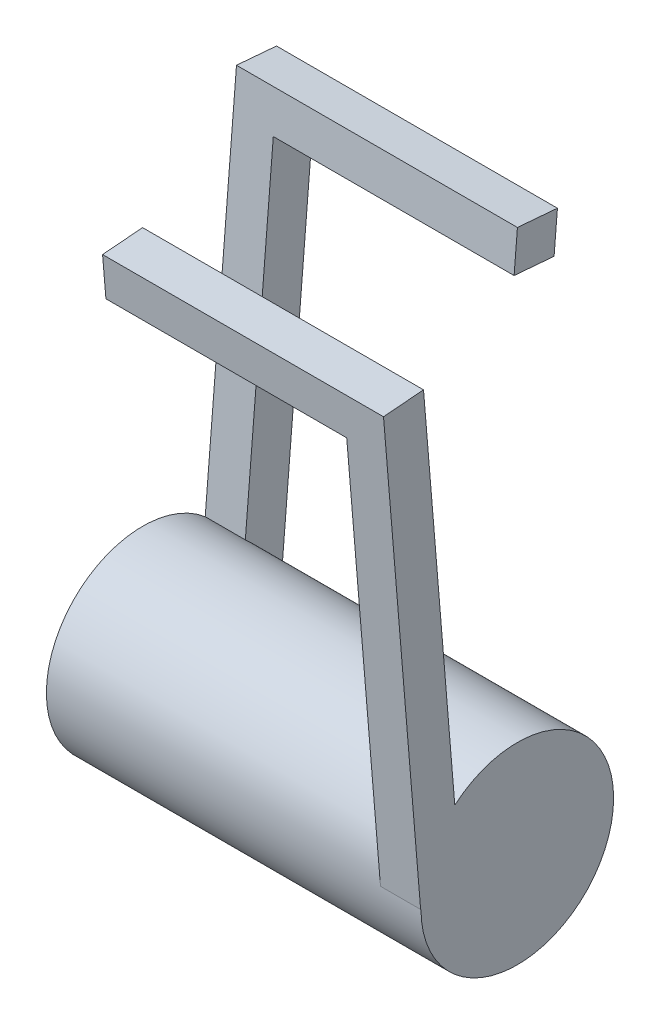
ISO-10303-21;
HEADER;
FILE_DESCRIPTION(('STEP AP214'),'2;1');
FILE_NAME('part.step','',(''),(''),'','','');
FILE_SCHEMA(('AUTOMOTIVE_DESIGN { 1 0 10303 214 1 1 1 1 }'));
ENDSEC;
DATA;
#1=APPLICATION_CONTEXT('core data for automotive mechanical design processes');
#2=APPLICATION_PROTOCOL_DEFINITION('international standard','automotive_design',2000,#1);
#3=PRODUCT_CONTEXT('',#1,'mechanical');
#4=PRODUCT('Part','Part','',(#3));
#5=PRODUCT_RELATED_PRODUCT_CATEGORY('part','',(#4));
#6=PRODUCT_DEFINITION_FORMATION('','',#4);
#7=PRODUCT_DEFINITION_CONTEXT('part definition',#1,'design');
#8=PRODUCT_DEFINITION('design','',#6,#7);
#9=PRODUCT_DEFINITION_SHAPE('','',#8);
#10=(LENGTH_UNIT() NAMED_UNIT(*) SI_UNIT(.MILLI.,.METRE.));
#11=(NAMED_UNIT(*) PLANE_ANGLE_UNIT() SI_UNIT($,.RADIAN.));
#12=(NAMED_UNIT(*) SI_UNIT($,.STERADIAN.) SOLID_ANGLE_UNIT());
#13=UNCERTAINTY_MEASURE_WITH_UNIT(LENGTH_MEASURE(1.E-05),#10,'distance_accuracy_value','');
#14=(GEOMETRIC_REPRESENTATION_CONTEXT(3) GLOBAL_UNCERTAINTY_ASSIGNED_CONTEXT((#13)) GLOBAL_UNIT_ASSIGNED_CONTEXT((#10,
#11,#12)) REPRESENTATION_CONTEXT('',''));
#15=CARTESIAN_POINT('',(0.,0.,0.));
#16=DIRECTION('',(0.,0.,1.));
#17=DIRECTION('',(1.,0.,0.));
#18=AXIS2_PLACEMENT_3D('',#15,#16,#17);
#19=CARTESIAN_POINT('',(14.,0.,0.));
#20=DIRECTION('',(-1.,0.,0.));
#21=DIRECTION('',(0.,0.,1.));
#22=AXIS2_PLACEMENT_3D('',#19,#20,#21);
#23=CYLINDRICAL_SURFACE('',#22,3.6);
#24=CARTESIAN_POINT('',(12.5,0.,0.));
#25=DIRECTION('',(1.,0.,0.));
#26=DIRECTION('',(0.,0.,-1.));
#27=AXIS2_PLACEMENT_3D('',#24,#25,#26);
#28=CIRCLE('',#27,3.6);
#29=CARTESIAN_POINT('',(12.5,2.73945118906813,2.33568131017765));
#30=VERTEX_POINT('',#29);
#31=CARTESIAN_POINT('',(12.5,0.00104134907400366,3.59999984938779));
#32=VERTEX_POINT('',#31);
#33=EDGE_CURVE('E11',#30,#32,#28,.T.);
#34=ORIENTED_EDGE('',*,*,#33,.F.);
#35=DIRECTION('',(-1.,0.,0.));
#36=VECTOR('',#35,1.);
#37=CARTESIAN_POINT('',(14.,2.73945118906813,2.33568131017765));
#38=LINE('',#37,#36);
#39=CARTESIAN_POINT('',(14.,2.73945118906813,2.33568131017765));
#40=VERTEX_POINT('',#39);
#41=EDGE_CURVE('E189',#30,#40,#38,.F.);
#42=ORIENTED_EDGE('',*,*,#41,.T.);
#43=CARTESIAN_POINT('',(14.,0.,0.));
#44=DIRECTION('',(1.,0.,0.));
#45=DIRECTION('',(0.,0.,-1.));
#46=AXIS2_PLACEMENT_3D('',#43,#44,#45);
#47=CIRCLE('',#46,3.6);
#48=CARTESIAN_POINT('',(14.,0.00104134907400366,3.59999984938779));
#49=VERTEX_POINT('',#48);
#50=EDGE_CURVE('E241',#49,#40,#47,.T.);
#51=ORIENTED_EDGE('',*,*,#50,.F.);
#52=DIRECTION('',(-1.,0.,0.));
#53=VECTOR('',#52,1.);
#54=CARTESIAN_POINT('',(14.,0.00104134907400366,3.59999984938779));
#55=LINE('',#54,#53);
#56=EDGE_CURVE('E183',#49,#32,#55,.T.);
#57=ORIENTED_EDGE('',*,*,#56,.T.);
#58=EDGE_LOOP('',(#34,#42,#51,#57));
#59=FACE_BOUND('',#58,.T.);
#60=CARTESIAN_POINT('',(1.5,0.,0.));
#61=DIRECTION('',(-1.,0.,0.));
#62=DIRECTION('',(0.,0.,1.));
#63=AXIS2_PLACEMENT_3D('',#60,#61,#62);
#64=CIRCLE('',#63,3.6);
#65=CARTESIAN_POINT('',(1.5,2.73945118906813,-2.33568131017765));
#66=VERTEX_POINT('',#65);
#67=CARTESIAN_POINT('',(1.5,0.00104134907400366,-3.59999984938779));
#68=VERTEX_POINT('',#67);
#69=EDGE_CURVE('E40',#66,#68,#64,.T.);
#70=ORIENTED_EDGE('',*,*,#69,.F.);
#71=DIRECTION('',(-1.,0.,0.));
#72=VECTOR('',#71,1.);
#73=CARTESIAN_POINT('',(14.,2.73945118906813,-2.33568131017765));
#74=LINE('',#73,#72);
#75=CARTESIAN_POINT('',(0.,2.73945118906813,-2.33568131017765));
#76=VERTEX_POINT('',#75);
#77=EDGE_CURVE('E237',#66,#76,#74,.T.);
#78=ORIENTED_EDGE('',*,*,#77,.T.);
#79=CARTESIAN_POINT('',(0.,0.,0.));
#80=DIRECTION('',(1.,0.,0.));
#81=DIRECTION('',(0.,0.,-1.));
#82=AXIS2_PLACEMENT_3D('',#79,#80,#81);
#83=CIRCLE('',#82,3.6);
#84=CARTESIAN_POINT('',(0.,0.00104134907400366,-3.59999984938779));
#85=VERTEX_POINT('',#84);
#86=EDGE_CURVE('E240',#76,#85,#83,.T.);
#87=ORIENTED_EDGE('',*,*,#86,.T.);
#88=DIRECTION('',(-1.,0.,0.));
#89=VECTOR('',#88,1.);
#90=CARTESIAN_POINT('',(14.,0.00104134907400366,-3.59999984938779));
#91=LINE('',#90,#89);
#92=EDGE_CURVE('E55',#85,#68,#91,.F.);
#93=ORIENTED_EDGE('',*,*,#92,.T.);
#94=EDGE_LOOP('',(#70,#78,#87,#93));
#95=FACE_BOUND('',#94,.T.);
#96=ADVANCED_FACE('F33',(#59,#95),#23,.T.);
#97=CARTESIAN_POINT('',(14.,0.,0.));
#98=DIRECTION('',(1.,0.,0.));
#99=DIRECTION('',(0.,0.,-1.));
#100=AXIS2_PLACEMENT_3D('',#97,#98,#99);
#101=PLANE('',#100);
#102=ORIENTED_EDGE('',*,*,#50,.T.);
#103=DIRECTION('',(0.,0.99654251223919,0.0830844227277468));
#104=VECTOR('',#103,1.);
#105=CARTESIAN_POINT('',(14.,16.7668865884861,3.50518623164122));
#106=LINE('',#105,#104);
#107=CARTESIAN_POINT('',(14.,16.7668865884861,3.50518623164122));
#108=VERTEX_POINT('',#107);
#109=EDGE_CURVE('E177',#40,#108,#106,.T.);
#110=ORIENTED_EDGE('',*,*,#109,.T.);
#111=DIRECTION('',(0.,-0.0830844227277459,0.99654251223919));
#112=VECTOR('',#111,1.);
#113=CARTESIAN_POINT('',(14.,16.6422599543945,5.));
#114=LINE('',#113,#112);
#115=CARTESIAN_POINT('',(14.,16.6422599543945,5.));
#116=VERTEX_POINT('',#115);
#117=EDGE_CURVE('E170',#108,#116,#114,.T.);
#118=ORIENTED_EDGE('',*,*,#117,.T.);
#119=DIRECTION('',(0.,-0.99654251223919,-0.0830844227277466));
#120=VECTOR('',#119,1.);
#121=CARTESIAN_POINT('',(14.,16.6422599543945,5.));
#122=LINE('',#121,#120);
#123=CARTESIAN_POINT('',(14.,0.,3.61249014044663));
#124=VERTEX_POINT('',#123);
#125=EDGE_CURVE('E165',#116,#124,#122,.T.);
#126=ORIENTED_EDGE('',*,*,#125,.T.);
#127=DIRECTION('',(0.,0.083084422727747,-0.99654251223919));
#128=VECTOR('',#127,1.);
#129=CARTESIAN_POINT('',(14.,0.,3.61249014044663));
#130=LINE('',#129,#128);
#131=EDGE_CURVE('E47',#124,#49,#130,.T.);
#132=ORIENTED_EDGE('',*,*,#131,.T.);
#133=EDGE_LOOP('',(#102,#110,#118,#126,#132));
#134=FACE_BOUND('',#133,.T.);
#135=ADVANCED_FACE('F283',(#134),#101,.T.);
#136=CARTESIAN_POINT('',(0.,0.,0.));
#137=DIRECTION('',(1.,0.,0.));
#138=DIRECTION('',(0.,0.,-1.));
#139=AXIS2_PLACEMENT_3D('',#136,#137,#138);
#140=PLANE('',#139);
#141=ORIENTED_EDGE('',*,*,#86,.F.);
#142=DIRECTION('',(0.,0.99654251223919,-0.0830844227277468));
#143=VECTOR('',#142,1.);
#144=CARTESIAN_POINT('',(0.,16.7668865884861,-3.50518623164122));
#145=LINE('',#144,#143);
#146=CARTESIAN_POINT('',(0.,16.7668865884861,-3.50518623164122));
#147=VERTEX_POINT('',#146);
#148=EDGE_CURVE('E226',#76,#147,#145,.T.);
#149=ORIENTED_EDGE('',*,*,#148,.T.);
#150=DIRECTION('',(0.,-0.0830844227277459,-0.99654251223919));
#151=VECTOR('',#150,1.);
#152=CARTESIAN_POINT('',(0.,16.6422599543945,-5.));
#153=LINE('',#152,#151);
#154=CARTESIAN_POINT('',(0.,16.6422599543945,-5.));
#155=VERTEX_POINT('',#154);
#156=EDGE_CURVE('E214',#147,#155,#153,.T.);
#157=ORIENTED_EDGE('',*,*,#156,.T.);
#158=DIRECTION('',(0.,-0.99654251223919,0.0830844227277466));
#159=VECTOR('',#158,1.);
#160=CARTESIAN_POINT('',(0.,16.6422599543945,-5.));
#161=LINE('',#160,#159);
#162=CARTESIAN_POINT('',(0.,0.,-3.61249014044663));
#163=VERTEX_POINT('',#162);
#164=EDGE_CURVE('E209',#155,#163,#161,.T.);
#165=ORIENTED_EDGE('',*,*,#164,.T.);
#166=DIRECTION('',(0.,0.083084422727747,0.99654251223919));
#167=VECTOR('',#166,1.);
#168=CARTESIAN_POINT('',(0.,0.,-3.61249014044663));
#169=LINE('',#168,#167);
#170=EDGE_CURVE('E223',#163,#85,#169,.T.);
#171=ORIENTED_EDGE('',*,*,#170,.T.);
#172=EDGE_LOOP('',(#141,#149,#157,#165,#171));
#173=FACE_BOUND('',#172,.T.);
#174=ADVANCED_FACE('F264',(#173),#140,.F.);
#175=CARTESIAN_POINT('',(1.5,16.7668865884861,-3.50518623164122));
#176=DIRECTION('',(0.,0.0830844227277468,0.99654251223919));
#177=DIRECTION('',(0.,-0.99654251223919,0.0830844227277468));
#178=AXIS2_PLACEMENT_3D('',#175,#176,#177);
#179=PLANE('',#178);
#180=ORIENTED_EDGE('',*,*,#77,.F.);
#181=DIRECTION('',(0.,0.99654251223919,-0.0830844227277468));
#182=VECTOR('',#181,1.);
#183=CARTESIAN_POINT('',(1.5,16.7668865884861,-3.50518623164122));
#184=LINE('',#183,#182);
#185=CARTESIAN_POINT('',(1.5,15.2720728201273,-3.3805595975496));
#186=VERTEX_POINT('',#185);
#187=EDGE_CURVE('E217',#66,#186,#184,.T.);
#188=ORIENTED_EDGE('',*,*,#187,.T.);
#189=DIRECTION('',(-1.,0.,0.));
#190=VECTOR('',#189,1.);
#191=CARTESIAN_POINT('',(10.5,15.2720728201273,-3.3805595975496));
#192=LINE('',#191,#190);
#193=CARTESIAN_POINT('',(10.5,15.2720728201273,-3.3805595975496));
#194=VERTEX_POINT('',#193);
#195=EDGE_CURVE('E204',#194,#186,#192,.T.);
#196=ORIENTED_EDGE('',*,*,#195,.F.);
#197=DIRECTION('',(0.,-0.99654251223919,0.083084422727747));
#198=VECTOR('',#197,1.);
#199=CARTESIAN_POINT('',(10.5,16.7668865884861,-3.50518623164122));
#200=LINE('',#199,#198);
#201=CARTESIAN_POINT('',(10.5,16.7668865884861,-3.50518623164122));
#202=VERTEX_POINT('',#201);
#203=EDGE_CURVE('E196',#202,#194,#200,.T.);
#204=ORIENTED_EDGE('',*,*,#203,.F.);
#205=DIRECTION('',(-1.,0.,0.));
#206=VECTOR('',#205,1.);
#207=CARTESIAN_POINT('',(1.5,16.7668865884861,-3.50518623164122));
#208=LINE('',#207,#206);
#209=EDGE_CURVE('E232',#202,#147,#208,.T.);
#210=ORIENTED_EDGE('',*,*,#209,.T.);
#211=ORIENTED_EDGE('',*,*,#148,.F.);
#212=EDGE_LOOP('',(#180,#188,#196,#204,#210,#211));
#213=FACE_BOUND('',#212,.T.);
#214=ADVANCED_FACE('F260',(#213),#179,.T.);
#215=CARTESIAN_POINT('',(1.5,0.,-3.61249014044663));
#216=DIRECTION('',(0.,-0.99654251223919,0.083084422727747));
#217=DIRECTION('',(0.,-0.083084422727747,-0.99654251223919));
#218=AXIS2_PLACEMENT_3D('',#215,#216,#217);
#219=PLANE('',#218);
#220=ORIENTED_EDGE('',*,*,#92,.F.);
#221=ORIENTED_EDGE('',*,*,#170,.F.);
#222=DIRECTION('',(-1.,0.,0.));
#223=VECTOR('',#222,1.);
#224=CARTESIAN_POINT('',(1.5,0.,-3.61249014044663));
#225=LINE('',#224,#223);
#226=CARTESIAN_POINT('',(1.5,0.,-3.61249014044663));
#227=VERTEX_POINT('',#226);
#228=EDGE_CURVE('E220',#227,#163,#225,.T.);
#229=ORIENTED_EDGE('',*,*,#228,.F.);
#230=DIRECTION('',(0.,0.083084422727747,0.99654251223919));
#231=VECTOR('',#230,1.);
#232=CARTESIAN_POINT('',(1.5,0.,-3.61249014044663));
#233=LINE('',#232,#231);
#234=EDGE_CURVE('E213',#227,#68,#233,.T.);
#235=ORIENTED_EDGE('',*,*,#234,.T.);
#236=EDGE_LOOP('',(#220,#221,#229,#235));
#237=FACE_BOUND('',#236,.T.);
#238=ADVANCED_FACE('F251',(#237),#219,.T.);
#239=CARTESIAN_POINT('',(1.5,16.6422599543945,-5.));
#240=DIRECTION('',(0.,-0.0830844227277466,-0.99654251223919));
#241=DIRECTION('',(0.,0.996542512239191,-0.0830844227277467));
#242=AXIS2_PLACEMENT_3D('',#239,#240,#241);
#243=PLANE('',#242);
#244=ORIENTED_EDGE('',*,*,#164,.F.);
#245=DIRECTION('',(-1.,0.,0.));
#246=VECTOR('',#245,1.);
#247=CARTESIAN_POINT('',(1.5,16.6422599543945,-5.));
#248=LINE('',#247,#246);
#249=CARTESIAN_POINT('',(10.5,16.6422599543945,-5.));
#250=VERTEX_POINT('',#249);
#251=EDGE_CURVE('E230',#250,#155,#248,.T.);
#252=ORIENTED_EDGE('',*,*,#251,.F.);
#253=DIRECTION('',(0.,-0.996542512239191,0.0830844227277465));
#254=VECTOR('',#253,1.);
#255=CARTESIAN_POINT('',(10.5,16.6422599543945,-5.));
#256=LINE('',#255,#254);
#257=CARTESIAN_POINT('',(10.5,15.1474461860357,-4.87537336590838));
#258=VERTEX_POINT('',#257);
#259=EDGE_CURVE('E201',#250,#258,#256,.T.);
#260=ORIENTED_EDGE('',*,*,#259,.T.);
#261=DIRECTION('',(-1.,0.,0.));
#262=VECTOR('',#261,1.);
#263=CARTESIAN_POINT('',(10.5,15.1474461860357,-4.87537336590838));
#264=LINE('',#263,#262);
#265=CARTESIAN_POINT('',(1.5,15.1474461860357,-4.87537336590838));
#266=VERTEX_POINT('',#265);
#267=EDGE_CURVE('E207',#258,#266,#264,.T.);
#268=ORIENTED_EDGE('',*,*,#267,.T.);
#269=DIRECTION('',(0.,-0.99654251223919,0.0830844227277466));
#270=VECTOR('',#269,1.);
#271=CARTESIAN_POINT('',(1.5,16.6422599543945,-5.));
#272=LINE('',#271,#270);
#273=EDGE_CURVE('E211',#266,#227,#272,.T.);
#274=ORIENTED_EDGE('',*,*,#273,.T.);
#275=ORIENTED_EDGE('',*,*,#228,.T.);
#276=EDGE_LOOP('',(#244,#252,#260,#268,#274,#275));
#277=FACE_BOUND('',#276,.T.);
#278=ADVANCED_FACE('F255',(#277),#243,.T.);
#279=CARTESIAN_POINT('',(1.5,16.6422599543945,-5.));
#280=DIRECTION('',(0.,0.996542512239191,-0.083084422727746));
#281=DIRECTION('',(0.,0.083084422727746,0.996542512239191));
#282=AXIS2_PLACEMENT_3D('',#279,#280,#281);
#283=PLANE('',#282);
#284=ORIENTED_EDGE('',*,*,#156,.F.);
#285=ORIENTED_EDGE('',*,*,#209,.F.);
#286=DIRECTION('',(0.,0.0830844227277459,0.99654251223919));
#287=VECTOR('',#286,1.);
#288=CARTESIAN_POINT('',(10.5,16.6422599543945,-5.));
#289=LINE('',#288,#287);
#290=EDGE_CURVE('E198',#250,#202,#289,.T.);
#291=ORIENTED_EDGE('',*,*,#290,.F.);
#292=ORIENTED_EDGE('',*,*,#251,.T.);
#293=EDGE_LOOP('',(#284,#285,#291,#292));
#294=FACE_BOUND('',#293,.T.);
#295=ADVANCED_FACE('F267',(#294),#283,.T.);
#296=CARTESIAN_POINT('',(1.5,0.,0.));
#297=DIRECTION('',(-1.,0.,0.));
#298=DIRECTION('',(0.,0.,1.));
#299=AXIS2_PLACEMENT_3D('',#296,#297,#298);
#300=PLANE('',#299);
#301=ORIENTED_EDGE('',*,*,#273,.F.);
#302=DIRECTION('',(0.,0.0830844227277447,0.996542512239191));
#303=VECTOR('',#302,1.);
#304=CARTESIAN_POINT('',(1.5,15.1474461860357,-4.87537336590838));
#305=LINE('',#304,#303);
#306=EDGE_CURVE('E192',#266,#186,#305,.T.);
#307=ORIENTED_EDGE('',*,*,#306,.T.);
#308=ORIENTED_EDGE('',*,*,#187,.F.);
#309=ORIENTED_EDGE('',*,*,#69,.T.);
#310=ORIENTED_EDGE('',*,*,#234,.F.);
#311=EDGE_LOOP('',(#301,#307,#308,#309,#310));
#312=FACE_BOUND('',#311,.T.);
#313=ADVANCED_FACE('F247',(#312),#300,.F.);
#314=CARTESIAN_POINT('',(10.5,15.1474461860357,-4.87537336590838));
#315=DIRECTION('',(0.,-0.996542512239191,0.0830844227277448));
#316=DIRECTION('',(0.,-0.0830844227277448,-0.996542512239191));
#317=AXIS2_PLACEMENT_3D('',#314,#315,#316);
#318=PLANE('',#317);
#319=ORIENTED_EDGE('',*,*,#306,.F.);
#320=ORIENTED_EDGE('',*,*,#267,.F.);
#321=DIRECTION('',(0.,0.0830844227277447,0.996542512239191));
#322=VECTOR('',#321,1.);
#323=CARTESIAN_POINT('',(10.5,15.1474461860357,-4.87537336590838));
#324=LINE('',#323,#322);
#325=EDGE_CURVE('E193',#258,#194,#324,.T.);
#326=ORIENTED_EDGE('',*,*,#325,.T.);
#327=ORIENTED_EDGE('',*,*,#195,.T.);
#328=EDGE_LOOP('',(#319,#320,#326,#327));
#329=FACE_BOUND('',#328,.T.);
#330=ADVANCED_FACE('F273',(#329),#318,.T.);
#331=CARTESIAN_POINT('',(10.5,0.,0.));
#332=DIRECTION('',(1.,0.,0.));
#333=DIRECTION('',(0.,0.,-1.));
#334=AXIS2_PLACEMENT_3D('',#331,#332,#333);
#335=PLANE('',#334);
#336=ORIENTED_EDGE('',*,*,#325,.F.);
#337=ORIENTED_EDGE('',*,*,#259,.F.);
#338=ORIENTED_EDGE('',*,*,#290,.T.);
#339=ORIENTED_EDGE('',*,*,#203,.T.);
#340=EDGE_LOOP('',(#336,#337,#338,#339));
#341=FACE_BOUND('',#340,.T.);
#342=ADVANCED_FACE('F272',(#341),#335,.T.);
#343=CARTESIAN_POINT('',(12.5,16.7668865884861,3.50518623164122));
#344=DIRECTION('',(0.,0.0830844227277468,-0.99654251223919));
#345=DIRECTION('',(0.,0.99654251223919,0.0830844227277468));
#346=AXIS2_PLACEMENT_3D('',#343,#344,#345);
#347=PLANE('',#346);
#348=ORIENTED_EDGE('',*,*,#41,.F.);
#349=DIRECTION('',(0.,0.99654251223919,0.0830844227277468));
#350=VECTOR('',#349,1.);
#351=CARTESIAN_POINT('',(12.5,16.7668865884861,3.50518623164122));
#352=LINE('',#351,#350);
#353=CARTESIAN_POINT('',(12.5,15.2720728201273,3.3805595975496));
#354=VERTEX_POINT('',#353);
#355=EDGE_CURVE('E151',#30,#354,#352,.T.);
#356=ORIENTED_EDGE('',*,*,#355,.T.);
#357=DIRECTION('',(1.,0.,0.));
#358=VECTOR('',#357,1.);
#359=CARTESIAN_POINT('',(3.5,15.2720728201273,3.3805595975496));
#360=LINE('',#359,#358);
#361=CARTESIAN_POINT('',(3.5,15.2720728201273,3.3805595975496));
#362=VERTEX_POINT('',#361);
#363=EDGE_CURVE('E148',#362,#354,#360,.T.);
#364=ORIENTED_EDGE('',*,*,#363,.F.);
#365=DIRECTION('',(0.,-0.99654251223919,-0.083084422727747));
#366=VECTOR('',#365,1.);
#367=CARTESIAN_POINT('',(3.5,16.7668865884861,3.50518623164122));
#368=LINE('',#367,#366);
#369=CARTESIAN_POINT('',(3.5,16.7668865884861,3.50518623164122));
#370=VERTEX_POINT('',#369);
#371=EDGE_CURVE('E135',#370,#362,#368,.T.);
#372=ORIENTED_EDGE('',*,*,#371,.F.);
#373=DIRECTION('',(1.,0.,0.));
#374=VECTOR('',#373,1.);
#375=CARTESIAN_POINT('',(12.5,16.7668865884861,3.50518623164122));
#376=LINE('',#375,#374);
#377=EDGE_CURVE('E184',#370,#108,#376,.T.);
#378=ORIENTED_EDGE('',*,*,#377,.T.);
#379=ORIENTED_EDGE('',*,*,#109,.F.);
#380=EDGE_LOOP('',(#348,#356,#364,#372,#378,#379));
#381=FACE_BOUND('',#380,.T.);
#382=ADVANCED_FACE('F149',(#381),#347,.T.);
#383=CARTESIAN_POINT('',(12.5,0.,3.61249014044663));
#384=DIRECTION('',(0.,-0.99654251223919,-0.083084422727747));
#385=DIRECTION('',(0.,0.083084422727747,-0.99654251223919));
#386=AXIS2_PLACEMENT_3D('',#383,#384,#385);
#387=PLANE('',#386);
#388=ORIENTED_EDGE('',*,*,#56,.F.);
#389=ORIENTED_EDGE('',*,*,#131,.F.);
#390=DIRECTION('',(1.,0.,0.));
#391=VECTOR('',#390,1.);
#392=CARTESIAN_POINT('',(12.5,0.,3.61249014044663));
#393=LINE('',#392,#391);
#394=CARTESIAN_POINT('',(12.5,0.,3.61249014044663));
#395=VERTEX_POINT('',#394);
#396=EDGE_CURVE('E174',#395,#124,#393,.T.);
#397=ORIENTED_EDGE('',*,*,#396,.F.);
#398=DIRECTION('',(0.,0.083084422727747,-0.99654251223919));
#399=VECTOR('',#398,1.);
#400=CARTESIAN_POINT('',(12.5,0.,3.61249014044663));
#401=LINE('',#400,#399);
#402=EDGE_CURVE('E169',#395,#32,#401,.T.);
#403=ORIENTED_EDGE('',*,*,#402,.T.);
#404=EDGE_LOOP('',(#388,#389,#397,#403));
#405=FACE_BOUND('',#404,.T.);
#406=ADVANCED_FACE('F297',(#405),#387,.T.);
#407=CARTESIAN_POINT('',(12.5,16.6422599543945,5.));
#408=DIRECTION('',(0.,-0.0830844227277466,0.99654251223919));
#409=DIRECTION('',(0.,-0.996542512239191,-0.0830844227277467));
#410=AXIS2_PLACEMENT_3D('',#407,#408,#409);
#411=PLANE('',#410);
#412=ORIENTED_EDGE('',*,*,#125,.F.);
#413=DIRECTION('',(1.,0.,0.));
#414=VECTOR('',#413,1.);
#415=CARTESIAN_POINT('',(12.5,16.6422599543945,5.));
#416=LINE('',#415,#414);
#417=CARTESIAN_POINT('',(3.5,16.6422599543945,5.));
#418=VERTEX_POINT('',#417);
#419=EDGE_CURVE('E181',#418,#116,#416,.T.);
#420=ORIENTED_EDGE('',*,*,#419,.F.);
#421=DIRECTION('',(0.,-0.996542512239191,-0.0830844227277465));
#422=VECTOR('',#421,1.);
#423=CARTESIAN_POINT('',(3.5,16.6422599543945,5.));
#424=LINE('',#423,#422);
#425=CARTESIAN_POINT('',(3.5,15.1474461860357,4.87537336590838));
#426=VERTEX_POINT('',#425);
#427=EDGE_CURVE('E156',#418,#426,#424,.T.);
#428=ORIENTED_EDGE('',*,*,#427,.T.);
#429=DIRECTION('',(1.,0.,0.));
#430=VECTOR('',#429,1.);
#431=CARTESIAN_POINT('',(3.5,15.1474461860357,4.87537336590838));
#432=LINE('',#431,#430);
#433=CARTESIAN_POINT('',(12.5,15.1474461860357,4.87537336590838));
#434=VERTEX_POINT('',#433);
#435=EDGE_CURVE('E155',#426,#434,#432,.T.);
#436=ORIENTED_EDGE('',*,*,#435,.T.);
#437=DIRECTION('',(0.,-0.99654251223919,-0.0830844227277466));
#438=VECTOR('',#437,1.);
#439=CARTESIAN_POINT('',(12.5,16.6422599543945,5.));
#440=LINE('',#439,#438);
#441=EDGE_CURVE('E167',#434,#395,#440,.T.);
#442=ORIENTED_EDGE('',*,*,#441,.T.);
#443=ORIENTED_EDGE('',*,*,#396,.T.);
#444=EDGE_LOOP('',(#412,#420,#428,#436,#442,#443));
#445=FACE_BOUND('',#444,.T.);
#446=ADVANCED_FACE('F300',(#445),#411,.T.);
#447=CARTESIAN_POINT('',(12.5,16.6422599543945,5.));
#448=DIRECTION('',(0.,0.996542512239191,0.083084422727746));
#449=DIRECTION('',(0.,-0.083084422727746,0.996542512239191));
#450=AXIS2_PLACEMENT_3D('',#447,#448,#449);
#451=PLANE('',#450);
#452=ORIENTED_EDGE('',*,*,#117,.F.);
#453=ORIENTED_EDGE('',*,*,#377,.F.);
#454=DIRECTION('',(0.,0.0830844227277459,-0.99654251223919));
#455=VECTOR('',#454,1.);
#456=CARTESIAN_POINT('',(3.5,16.6422599543945,5.));
#457=LINE('',#456,#455);
#458=EDGE_CURVE('E143',#418,#370,#457,.T.);
#459=ORIENTED_EDGE('',*,*,#458,.F.);
#460=ORIENTED_EDGE('',*,*,#419,.T.);
#461=EDGE_LOOP('',(#452,#453,#459,#460));
#462=FACE_BOUND('',#461,.T.);
#463=ADVANCED_FACE('F303',(#462),#451,.T.);
#464=CARTESIAN_POINT('',(12.5,0.,0.));
#465=DIRECTION('',(1.,0.,0.));
#466=DIRECTION('',(0.,0.,-1.));
#467=AXIS2_PLACEMENT_3D('',#464,#465,#466);
#468=PLANE('',#467);
#469=ORIENTED_EDGE('',*,*,#441,.F.);
#470=DIRECTION('',(0.,0.0830844227277447,-0.996542512239191));
#471=VECTOR('',#470,1.);
#472=CARTESIAN_POINT('',(12.5,15.1474461860357,4.87537336590838));
#473=LINE('',#472,#471);
#474=EDGE_CURVE('E159',#434,#354,#473,.T.);
#475=ORIENTED_EDGE('',*,*,#474,.T.);
#476=ORIENTED_EDGE('',*,*,#355,.F.);
#477=ORIENTED_EDGE('',*,*,#33,.T.);
#478=ORIENTED_EDGE('',*,*,#402,.F.);
#479=EDGE_LOOP('',(#469,#475,#476,#477,#478));
#480=FACE_BOUND('',#479,.T.);
#481=ADVANCED_FACE('F294',(#480),#468,.F.);
#482=CARTESIAN_POINT('',(3.5,15.1474461860357,4.87537336590838));
#483=DIRECTION('',(0.,-0.996542512239191,-0.0830844227277448));
#484=DIRECTION('',(0.,0.0830844227277448,-0.996542512239191));
#485=AXIS2_PLACEMENT_3D('',#482,#483,#484);
#486=PLANE('',#485);
#487=ORIENTED_EDGE('',*,*,#474,.F.);
#488=ORIENTED_EDGE('',*,*,#435,.F.);
#489=DIRECTION('',(0.,0.0830844227277447,-0.996542512239191));
#490=VECTOR('',#489,1.);
#491=CARTESIAN_POINT('',(3.5,15.1474461860357,4.87537336590838));
#492=LINE('',#491,#490);
#493=EDGE_CURVE('E140',#426,#362,#492,.T.);
#494=ORIENTED_EDGE('',*,*,#493,.T.);
#495=ORIENTED_EDGE('',*,*,#363,.T.);
#496=EDGE_LOOP('',(#487,#488,#494,#495));
#497=FACE_BOUND('',#496,.T.);
#498=ADVANCED_FACE('F158',(#497),#486,.T.);
#499=CARTESIAN_POINT('',(3.5,0.,0.));
#500=DIRECTION('',(-1.,0.,0.));
#501=DIRECTION('',(0.,0.,1.));
#502=AXIS2_PLACEMENT_3D('',#499,#500,#501);
#503=PLANE('',#502);
#504=ORIENTED_EDGE('',*,*,#493,.F.);
#505=ORIENTED_EDGE('',*,*,#427,.F.);
#506=ORIENTED_EDGE('',*,*,#458,.T.);
#507=ORIENTED_EDGE('',*,*,#371,.T.);
#508=EDGE_LOOP('',(#504,#505,#506,#507));
#509=FACE_BOUND('',#508,.T.);
#510=ADVANCED_FACE('F137',(#509),#503,.T.);
#511=CLOSED_SHELL('',(#96,#135,#174,#214,#238,#278,#295,#313,#330,#342,#382,#406,#446,#463,#481,
#498,#510));
#512=MANIFOLD_SOLID_BREP('B2',#511);
#513=ADVANCED_BREP_SHAPE_REPRESENTATION('',(#18,#512),#14);
#514=SHAPE_DEFINITION_REPRESENTATION(#9,#513);
ENDSEC;
END-ISO-10303-21;
